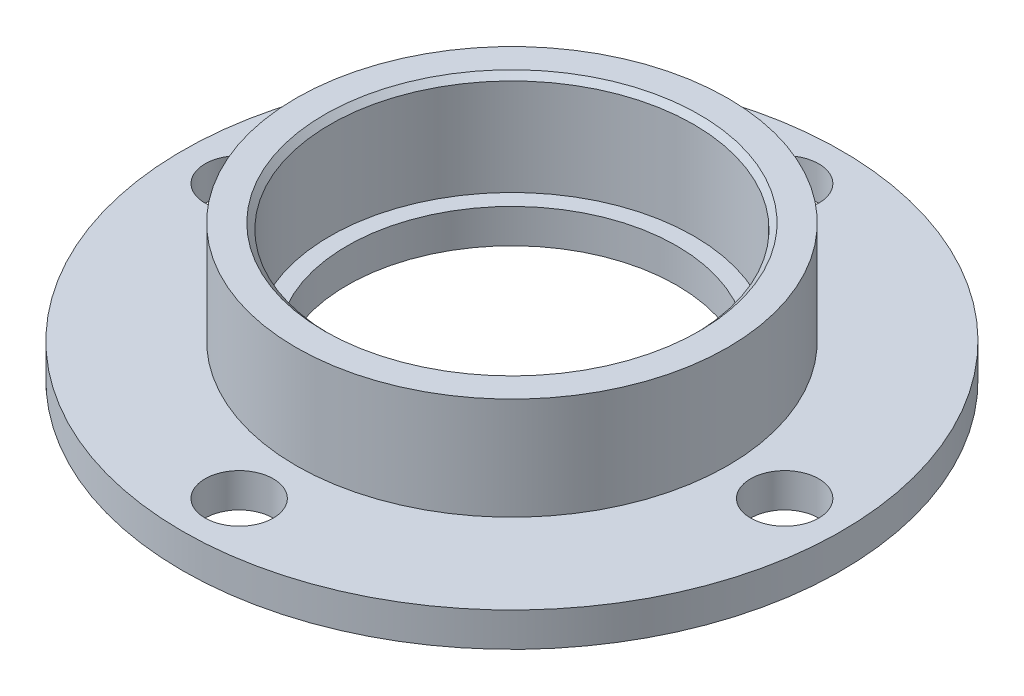
ISO-10303-21;
HEADER;
FILE_DESCRIPTION(('STEP AP214'),'2;1');
FILE_NAME('part.step','',(''),(''),'','','');
FILE_SCHEMA(('AUTOMOTIVE_DESIGN { 1 0 10303 214 1 1 1 1 }'));
ENDSEC;
DATA;
#1=APPLICATION_CONTEXT('core data for automotive mechanical design processes');
#2=APPLICATION_PROTOCOL_DEFINITION('international standard','automotive_design',2000,#1);
#3=PRODUCT_CONTEXT('',#1,'mechanical');
#4=PRODUCT('Part','Part','',(#3));
#5=PRODUCT_RELATED_PRODUCT_CATEGORY('part','',(#4));
#6=PRODUCT_DEFINITION_FORMATION('','',#4);
#7=PRODUCT_DEFINITION_CONTEXT('part definition',#1,'design');
#8=PRODUCT_DEFINITION('design','',#6,#7);
#9=PRODUCT_DEFINITION_SHAPE('','',#8);
#10=(LENGTH_UNIT() NAMED_UNIT(*) SI_UNIT(.MILLI.,.METRE.));
#11=(NAMED_UNIT(*) PLANE_ANGLE_UNIT() SI_UNIT($,.RADIAN.));
#12=(NAMED_UNIT(*) SI_UNIT($,.STERADIAN.) SOLID_ANGLE_UNIT());
#13=UNCERTAINTY_MEASURE_WITH_UNIT(LENGTH_MEASURE(1.E-05),#10,'distance_accuracy_value','');
#14=(GEOMETRIC_REPRESENTATION_CONTEXT(3) GLOBAL_UNCERTAINTY_ASSIGNED_CONTEXT((#13)) GLOBAL_UNIT_ASSIGNED_CONTEXT((#10,
#11,#12)) REPRESENTATION_CONTEXT('',''));
#15=CARTESIAN_POINT('',(0.,0.,0.));
#16=DIRECTION('',(0.,0.,1.));
#17=DIRECTION('',(1.,0.,0.));
#18=AXIS2_PLACEMENT_3D('',#15,#16,#17);
#19=CARTESIAN_POINT('',(0.,3.,0.));
#20=DIRECTION('',(0.,1.,0.));
#21=DIRECTION('',(0.,0.,1.));
#22=AXIS2_PLACEMENT_3D('',#19,#20,#21);
#23=PLANE('',#22);
#24=CARTESIAN_POINT('',(0.,3.,0.));
#25=DIRECTION('',(0.,1.,0.));
#26=DIRECTION('',(0.,0.,1.));
#27=AXIS2_PLACEMENT_3D('',#24,#25,#26);
#28=CIRCLE('',#27,14.5);
#29=CARTESIAN_POINT('',(0.,3.,14.5));
#30=VERTEX_POINT('',#29);
#31=EDGE_CURVE('E77',#30,#30,#28,.T.);
#32=ORIENTED_EDGE('',*,*,#31,.F.);
#33=EDGE_LOOP('',(#32));
#34=FACE_BOUND('',#33,.T.);
#35=CARTESIAN_POINT('',(0.,3.,0.));
#36=DIRECTION('',(0.,1.,0.));
#37=DIRECTION('',(0.,0.,1.));
#38=AXIS2_PLACEMENT_3D('',#35,#36,#37);
#39=CIRCLE('',#38,16.);
#40=CARTESIAN_POINT('',(0.,3.,16.));
#41=VERTEX_POINT('',#40);
#42=EDGE_CURVE('E92',#41,#41,#39,.T.);
#43=ORIENTED_EDGE('',*,*,#42,.T.);
#44=EDGE_LOOP('',(#43));
#45=FACE_BOUND('',#44,.T.);
#46=ADVANCED_FACE('F51',(#34,#45),#23,.T.);
#47=CARTESIAN_POINT('',(0.,3.,-24.));
#48=DIRECTION('',(0.,1.,0.));
#49=DIRECTION('',(0.,0.,1.));
#50=AXIS2_PLACEMENT_3D('',#47,#48,#49);
#51=CIRCLE('',#50,3.);
#52=CARTESIAN_POINT('',(0.,3.,-21.));
#53=VERTEX_POINT('',#52);
#54=EDGE_CURVE('E124',#53,#53,#51,.T.);
#55=ORIENTED_EDGE('',*,*,#54,.F.);
#56=EDGE_LOOP('',(#55));
#57=FACE_BOUND('',#56,.T.);
#58=CARTESIAN_POINT('',(24.,3.,0.));
#59=DIRECTION('',(0.,1.,0.));
#60=DIRECTION('',(0.,0.,1.));
#61=AXIS2_PLACEMENT_3D('',#58,#59,#60);
#62=CIRCLE('',#61,3.);
#63=CARTESIAN_POINT('',(24.,3.,3.));
#64=VERTEX_POINT('',#63);
#65=EDGE_CURVE('E116',#64,#64,#62,.T.);
#66=ORIENTED_EDGE('',*,*,#65,.F.);
#67=EDGE_LOOP('',(#66));
#68=FACE_BOUND('',#67,.T.);
#69=CARTESIAN_POINT('',(0.,3.,24.));
#70=DIRECTION('',(0.,1.,0.));
#71=DIRECTION('',(0.,0.,1.));
#72=AXIS2_PLACEMENT_3D('',#69,#70,#71);
#73=CIRCLE('',#72,3.);
#74=CARTESIAN_POINT('',(0.,3.,27.));
#75=VERTEX_POINT('',#74);
#76=EDGE_CURVE('E108',#75,#75,#73,.T.);
#77=ORIENTED_EDGE('',*,*,#76,.F.);
#78=EDGE_LOOP('',(#77));
#79=FACE_BOUND('',#78,.T.);
#80=CARTESIAN_POINT('',(-24.,3.,0.));
#81=DIRECTION('',(0.,1.,0.));
#82=DIRECTION('',(0.,0.,1.));
#83=AXIS2_PLACEMENT_3D('',#80,#81,#82);
#84=CIRCLE('',#83,3.);
#85=CARTESIAN_POINT('',(-24.,3.,3.));
#86=VERTEX_POINT('',#85);
#87=EDGE_CURVE('E100',#86,#86,#84,.T.);
#88=ORIENTED_EDGE('',*,*,#87,.F.);
#89=EDGE_LOOP('',(#88));
#90=FACE_BOUND('',#89,.T.);
#91=CARTESIAN_POINT('',(0.,3.,0.));
#92=DIRECTION('',(0.,1.,0.));
#93=DIRECTION('',(0.,0.,1.));
#94=AXIS2_PLACEMENT_3D('',#91,#92,#93);
#95=CIRCLE('',#94,19.);
#96=CARTESIAN_POINT('',(0.,3.,19.));
#97=VERTEX_POINT('',#96);
#98=EDGE_CURVE('E65',#97,#97,#95,.T.);
#99=ORIENTED_EDGE('',*,*,#98,.F.);
#100=EDGE_LOOP('',(#99));
#101=FACE_BOUND('',#100,.T.);
#102=CARTESIAN_POINT('',(0.,3.,0.));
#103=DIRECTION('',(0.,1.,0.));
#104=DIRECTION('',(0.,0.,1.));
#105=AXIS2_PLACEMENT_3D('',#102,#103,#104);
#106=CIRCLE('',#105,29.);
#107=CARTESIAN_POINT('',(0.,3.,29.));
#108=VERTEX_POINT('',#107);
#109=EDGE_CURVE('E70',#108,#108,#106,.T.);
#110=ORIENTED_EDGE('',*,*,#109,.T.);
#111=EDGE_LOOP('',(#110));
#112=FACE_BOUND('',#111,.T.);
#113=ADVANCED_FACE('F131',(#57,#68,#79,#90,#101,#112),#23,.T.);
#114=CARTESIAN_POINT('',(0.,0.,0.));
#115=DIRECTION('',(0.,1.,0.));
#116=DIRECTION('',(0.,0.,1.));
#117=AXIS2_PLACEMENT_3D('',#114,#115,#116);
#118=PLANE('',#117);
#119=CARTESIAN_POINT('',(0.,0.,-24.));
#120=DIRECTION('',(0.,1.,0.));
#121=DIRECTION('',(0.,0.,1.));
#122=AXIS2_PLACEMENT_3D('',#119,#120,#121);
#123=CIRCLE('',#122,3.);
#124=CARTESIAN_POINT('',(0.,0.,-21.));
#125=VERTEX_POINT('',#124);
#126=EDGE_CURVE('E120',#125,#125,#123,.T.);
#127=ORIENTED_EDGE('',*,*,#126,.T.);
#128=EDGE_LOOP('',(#127));
#129=FACE_BOUND('',#128,.T.);
#130=CARTESIAN_POINT('',(24.,0.,0.));
#131=DIRECTION('',(0.,1.,0.));
#132=DIRECTION('',(0.,0.,1.));
#133=AXIS2_PLACEMENT_3D('',#130,#131,#132);
#134=CIRCLE('',#133,3.);
#135=CARTESIAN_POINT('',(24.,0.,3.));
#136=VERTEX_POINT('',#135);
#137=EDGE_CURVE('E112',#136,#136,#134,.T.);
#138=ORIENTED_EDGE('',*,*,#137,.T.);
#139=EDGE_LOOP('',(#138));
#140=FACE_BOUND('',#139,.T.);
#141=CARTESIAN_POINT('',(0.,0.,24.));
#142=DIRECTION('',(0.,1.,0.));
#143=DIRECTION('',(0.,0.,1.));
#144=AXIS2_PLACEMENT_3D('',#141,#142,#143);
#145=CIRCLE('',#144,3.);
#146=CARTESIAN_POINT('',(0.,0.,27.));
#147=VERTEX_POINT('',#146);
#148=EDGE_CURVE('E104',#147,#147,#145,.T.);
#149=ORIENTED_EDGE('',*,*,#148,.T.);
#150=EDGE_LOOP('',(#149));
#151=FACE_BOUND('',#150,.T.);
#152=CARTESIAN_POINT('',(-24.,0.,0.));
#153=DIRECTION('',(0.,1.,0.));
#154=DIRECTION('',(0.,0.,1.));
#155=AXIS2_PLACEMENT_3D('',#152,#153,#154);
#156=CIRCLE('',#155,3.);
#157=CARTESIAN_POINT('',(-24.,0.,3.));
#158=VERTEX_POINT('',#157);
#159=EDGE_CURVE('E96',#158,#158,#156,.T.);
#160=ORIENTED_EDGE('',*,*,#159,.T.);
#161=EDGE_LOOP('',(#160));
#162=FACE_BOUND('',#161,.T.);
#163=CARTESIAN_POINT('',(0.,0.,0.));
#164=DIRECTION('',(0.,1.,0.));
#165=DIRECTION('',(0.,0.,1.));
#166=AXIS2_PLACEMENT_3D('',#163,#164,#165);
#167=CIRCLE('',#166,29.);
#168=CARTESIAN_POINT('',(0.,0.,29.));
#169=VERTEX_POINT('',#168);
#170=EDGE_CURVE('E73',#169,#169,#167,.T.);
#171=ORIENTED_EDGE('',*,*,#170,.F.);
#172=EDGE_LOOP('',(#171));
#173=FACE_BOUND('',#172,.T.);
#174=CARTESIAN_POINT('',(0.,0.,0.));
#175=DIRECTION('',(0.,1.,0.));
#176=DIRECTION('',(0.,0.,1.));
#177=AXIS2_PLACEMENT_3D('',#174,#175,#176);
#178=CIRCLE('',#177,14.5);
#179=CARTESIAN_POINT('',(0.,0.,14.5));
#180=VERTEX_POINT('',#179);
#181=EDGE_CURVE('E81',#180,#180,#178,.T.);
#182=ORIENTED_EDGE('',*,*,#181,.T.);
#183=EDGE_LOOP('',(#182));
#184=FACE_BOUND('',#183,.T.);
#185=ADVANCED_FACE('F134',(#129,#140,#151,#162,#173,#184),#118,.F.);
#186=CARTESIAN_POINT('',(0.,3.,0.));
#187=DIRECTION('',(0.,-1.,0.));
#188=DIRECTION('',(0.,0.,-1.));
#189=AXIS2_PLACEMENT_3D('',#186,#187,#188);
#190=CYLINDRICAL_SURFACE('',#189,29.);
#191=ORIENTED_EDGE('',*,*,#109,.F.);
#192=EDGE_LOOP('',(#191));
#193=FACE_BOUND('',#192,.T.);
#194=ORIENTED_EDGE('',*,*,#170,.T.);
#195=EDGE_LOOP('',(#194));
#196=FACE_BOUND('',#195,.T.);
#197=ADVANCED_FACE('F146',(#193,#196),#190,.T.);
#198=CARTESIAN_POINT('',(0.,3.,0.));
#199=DIRECTION('',(0.,-1.,0.));
#200=DIRECTION('',(0.,0.,-1.));
#201=AXIS2_PLACEMENT_3D('',#198,#199,#200);
#202=CYLINDRICAL_SURFACE('',#201,14.5);
#203=ORIENTED_EDGE('',*,*,#31,.T.);
#204=EDGE_LOOP('',(#203));
#205=FACE_BOUND('',#204,.T.);
#206=ORIENTED_EDGE('',*,*,#181,.F.);
#207=EDGE_LOOP('',(#206));
#208=FACE_BOUND('',#207,.T.);
#209=ADVANCED_FACE('F149',(#205,#208),#202,.F.);
#210=CARTESIAN_POINT('',(0.,12.,0.));
#211=DIRECTION('',(0.,1.,0.));
#212=DIRECTION('',(0.,0.,1.));
#213=AXIS2_PLACEMENT_3D('',#210,#211,#212);
#214=PLANE('',#213);
#215=CARTESIAN_POINT('',(0.,12.,0.));
#216=DIRECTION('',(0.,1.,0.));
#217=DIRECTION('',(0.,0.,1.));
#218=AXIS2_PLACEMENT_3D('',#215,#216,#217);
#219=CIRCLE('',#218,16.5);
#220=CARTESIAN_POINT('',(0.,12.,16.5));
#221=VERTEX_POINT('',#220);
#222=EDGE_CURVE('E10',#221,#221,#219,.F.);
#223=ORIENTED_EDGE('',*,*,#222,.T.);
#224=EDGE_LOOP('',(#223));
#225=FACE_BOUND('',#224,.T.);
#226=CARTESIAN_POINT('',(0.,12.,0.));
#227=DIRECTION('',(0.,1.,0.));
#228=DIRECTION('',(0.,0.,1.));
#229=AXIS2_PLACEMENT_3D('',#226,#227,#228);
#230=CIRCLE('',#229,19.);
#231=CARTESIAN_POINT('',(0.,12.,19.));
#232=VERTEX_POINT('',#231);
#233=EDGE_CURVE('E85',#232,#232,#230,.T.);
#234=ORIENTED_EDGE('',*,*,#233,.T.);
#235=EDGE_LOOP('',(#234));
#236=FACE_BOUND('',#235,.T.);
#237=ADVANCED_FACE('F159',(#225,#236),#214,.T.);
#238=CARTESIAN_POINT('',(0.,12.,0.));
#239=DIRECTION('',(0.,-1.,0.));
#240=DIRECTION('',(0.,0.,-1.));
#241=AXIS2_PLACEMENT_3D('',#238,#239,#240);
#242=CYLINDRICAL_SURFACE('',#241,19.);
#243=ORIENTED_EDGE('',*,*,#233,.F.);
#244=EDGE_LOOP('',(#243));
#245=FACE_BOUND('',#244,.T.);
#246=ORIENTED_EDGE('',*,*,#98,.T.);
#247=EDGE_LOOP('',(#246));
#248=FACE_BOUND('',#247,.T.);
#249=ADVANCED_FACE('F166',(#245,#248),#242,.T.);
#250=CARTESIAN_POINT('',(0.,12.,0.));
#251=DIRECTION('',(0.,-1.,0.));
#252=DIRECTION('',(0.,0.,-1.));
#253=AXIS2_PLACEMENT_3D('',#250,#251,#252);
#254=CYLINDRICAL_SURFACE('',#253,16.);
#255=CARTESIAN_POINT('',(0.,11.5,0.));
#256=DIRECTION('',(0.,1.,0.));
#257=DIRECTION('',(0.,0.,1.));
#258=AXIS2_PLACEMENT_3D('',#255,#256,#257);
#259=CIRCLE('',#258,16.);
#260=CARTESIAN_POINT('',(0.,11.5,16.));
#261=VERTEX_POINT('',#260);
#262=EDGE_CURVE('E60',#261,#261,#259,.T.);
#263=ORIENTED_EDGE('',*,*,#262,.T.);
#264=EDGE_LOOP('',(#263));
#265=FACE_BOUND('',#264,.T.);
#266=ORIENTED_EDGE('',*,*,#42,.F.);
#267=EDGE_LOOP('',(#266));
#268=FACE_BOUND('',#267,.T.);
#269=ADVANCED_FACE('F177',(#265,#268),#254,.F.);
#270=CARTESIAN_POINT('',(-24.,3.,0.));
#271=DIRECTION('',(0.,1.,0.));
#272=DIRECTION('',(0.,0.,1.));
#273=AXIS2_PLACEMENT_3D('',#270,#271,#272);
#274=CYLINDRICAL_SURFACE('',#273,3.);
#275=ORIENTED_EDGE('',*,*,#159,.F.);
#276=EDGE_LOOP('',(#275));
#277=FACE_BOUND('',#276,.T.);
#278=ORIENTED_EDGE('',*,*,#87,.T.);
#279=EDGE_LOOP('',(#278));
#280=FACE_BOUND('',#279,.T.);
#281=ADVANCED_FACE('F179',(#277,#280),#274,.F.);
#282=CARTESIAN_POINT('',(0.,3.,24.));
#283=DIRECTION('',(0.,1.,0.));
#284=DIRECTION('',(0.,0.,1.));
#285=AXIS2_PLACEMENT_3D('',#282,#283,#284);
#286=CYLINDRICAL_SURFACE('',#285,3.);
#287=ORIENTED_EDGE('',*,*,#148,.F.);
#288=EDGE_LOOP('',(#287));
#289=FACE_BOUND('',#288,.T.);
#290=ORIENTED_EDGE('',*,*,#76,.T.);
#291=EDGE_LOOP('',(#290));
#292=FACE_BOUND('',#291,.T.);
#293=ADVANCED_FACE('F185',(#289,#292),#286,.F.);
#294=CARTESIAN_POINT('',(24.,3.,0.));
#295=DIRECTION('',(0.,1.,0.));
#296=DIRECTION('',(0.,0.,1.));
#297=AXIS2_PLACEMENT_3D('',#294,#295,#296);
#298=CYLINDRICAL_SURFACE('',#297,3.);
#299=ORIENTED_EDGE('',*,*,#137,.F.);
#300=EDGE_LOOP('',(#299));
#301=FACE_BOUND('',#300,.T.);
#302=ORIENTED_EDGE('',*,*,#65,.T.);
#303=EDGE_LOOP('',(#302));
#304=FACE_BOUND('',#303,.T.);
#305=ADVANCED_FACE('F192',(#301,#304),#298,.F.);
#306=CARTESIAN_POINT('',(0.,3.,-24.));
#307=DIRECTION('',(0.,1.,0.));
#308=DIRECTION('',(0.,0.,1.));
#309=AXIS2_PLACEMENT_3D('',#306,#307,#308);
#310=CYLINDRICAL_SURFACE('',#309,3.);
#311=ORIENTED_EDGE('',*,*,#126,.F.);
#312=EDGE_LOOP('',(#311));
#313=FACE_BOUND('',#312,.T.);
#314=ORIENTED_EDGE('',*,*,#54,.T.);
#315=EDGE_LOOP('',(#314));
#316=FACE_BOUND('',#315,.T.);
#317=ADVANCED_FACE('F129',(#313,#316),#310,.F.);
#318=CARTESIAN_POINT('',(0.,11.5,0.));
#319=DIRECTION('',(0.,1.,0.));
#320=DIRECTION('',(0.,0.,1.));
#321=AXIS2_PLACEMENT_3D('',#318,#319,#320);
#322=CONICAL_SURFACE('',#321,16.,0.785398163397441);
#323=ORIENTED_EDGE('',*,*,#222,.F.);
#324=EDGE_LOOP('',(#323));
#325=FACE_BOUND('',#324,.T.);
#326=ORIENTED_EDGE('',*,*,#262,.F.);
#327=EDGE_LOOP('',(#326));
#328=FACE_BOUND('',#327,.T.);
#329=ADVANCED_FACE('F54',(#325,#328),#322,.F.);
#330=CLOSED_SHELL('',(#46,#113,#185,#197,#209,#237,#249,#269,#281,#293,#305,#317,#329));
#331=MANIFOLD_SOLID_BREP('B2',#330);
#332=ADVANCED_BREP_SHAPE_REPRESENTATION('',(#18,#331),#14);
#333=SHAPE_DEFINITION_REPRESENTATION(#9,#332);
ENDSEC;
END-ISO-10303-21;
